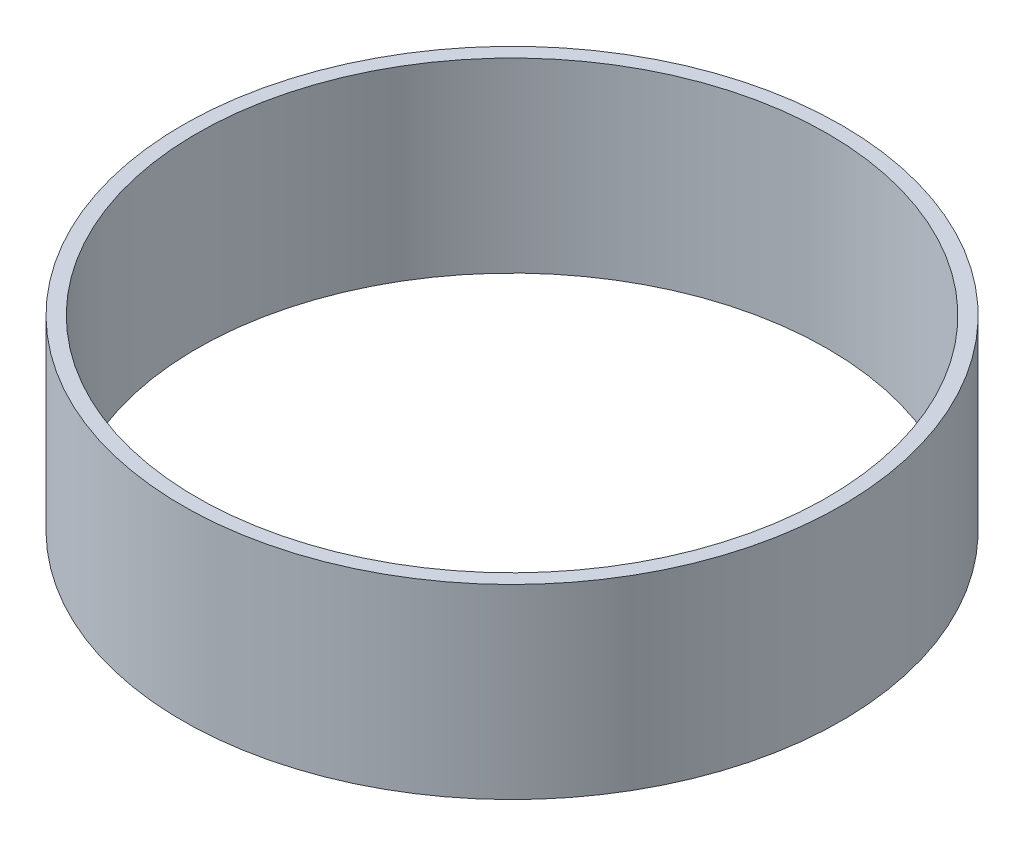
ISO-10303-21;
HEADER;
FILE_DESCRIPTION(('STEP AP214'),'2;1');
FILE_NAME('part.step','',(''),(''),'','','');
FILE_SCHEMA(('AUTOMOTIVE_DESIGN { 1 0 10303 214 1 1 1 1 }'));
ENDSEC;
DATA;
#1=APPLICATION_CONTEXT('core data for automotive mechanical design processes');
#2=APPLICATION_PROTOCOL_DEFINITION('international standard','automotive_design',2000,#1);
#3=PRODUCT_CONTEXT('',#1,'mechanical');
#4=PRODUCT('Part','Part','',(#3));
#5=PRODUCT_RELATED_PRODUCT_CATEGORY('part','',(#4));
#6=PRODUCT_DEFINITION_FORMATION('','',#4);
#7=PRODUCT_DEFINITION_CONTEXT('part definition',#1,'design');
#8=PRODUCT_DEFINITION('design','',#6,#7);
#9=PRODUCT_DEFINITION_SHAPE('','',#8);
#10=(LENGTH_UNIT() NAMED_UNIT(*) SI_UNIT(.MILLI.,.METRE.));
#11=(NAMED_UNIT(*) PLANE_ANGLE_UNIT() SI_UNIT($,.RADIAN.));
#12=(NAMED_UNIT(*) SI_UNIT($,.STERADIAN.) SOLID_ANGLE_UNIT());
#13=UNCERTAINTY_MEASURE_WITH_UNIT(LENGTH_MEASURE(1.E-05),#10,'distance_accuracy_value','');
#14=(GEOMETRIC_REPRESENTATION_CONTEXT(3) GLOBAL_UNCERTAINTY_ASSIGNED_CONTEXT((#13)) GLOBAL_UNIT_ASSIGNED_CONTEXT((#10,
#11,#12)) REPRESENTATION_CONTEXT('',''));
#15=CARTESIAN_POINT('',(0.,0.,0.));
#16=DIRECTION('',(0.,0.,1.));
#17=DIRECTION('',(1.,0.,0.));
#18=AXIS2_PLACEMENT_3D('',#15,#16,#17);
#19=CARTESIAN_POINT('',(0.,26.,0.));
#20=DIRECTION('',(0.,1.,0.));
#21=DIRECTION('',(0.,0.,1.));
#22=AXIS2_PLACEMENT_3D('',#19,#20,#21);
#23=PLANE('',#22);
#24=CARTESIAN_POINT('',(0.,26.,0.));
#25=DIRECTION('',(0.,1.,0.));
#26=DIRECTION('',(0.,0.,1.));
#27=AXIS2_PLACEMENT_3D('',#24,#25,#26);
#28=CIRCLE('',#27,46.);
#29=CARTESIAN_POINT('',(0.,26.,-46.));
#30=VERTEX_POINT('',#29);
#31=EDGE_CURVE('E10',#30,#30,#28,.T.);
#32=ORIENTED_EDGE('',*,*,#31,.T.);
#33=EDGE_LOOP('',(#32));
#34=FACE_BOUND('',#33,.T.);
#35=CARTESIAN_POINT('',(0.,26.,0.));
#36=DIRECTION('',(0.,1.,0.));
#37=DIRECTION('',(0.,0.,1.));
#38=AXIS2_PLACEMENT_3D('',#35,#36,#37);
#39=CIRCLE('',#38,44.);
#40=CARTESIAN_POINT('',(0.,26.,-44.));
#41=VERTEX_POINT('',#40);
#42=EDGE_CURVE('E43',#41,#41,#39,.T.);
#43=ORIENTED_EDGE('',*,*,#42,.F.);
#44=EDGE_LOOP('',(#43));
#45=FACE_BOUND('',#44,.T.);
#46=ADVANCED_FACE('F32',(#34,#45),#23,.T.);
#47=CARTESIAN_POINT('',(0.,0.,0.));
#48=DIRECTION('',(0.,1.,0.));
#49=DIRECTION('',(0.,0.,1.));
#50=AXIS2_PLACEMENT_3D('',#47,#48,#49);
#51=PLANE('',#50);
#52=CARTESIAN_POINT('',(0.,0.,0.));
#53=DIRECTION('',(0.,1.,0.));
#54=DIRECTION('',(0.,0.,1.));
#55=AXIS2_PLACEMENT_3D('',#52,#53,#54);
#56=CIRCLE('',#55,46.);
#57=CARTESIAN_POINT('',(0.,0.,-46.));
#58=VERTEX_POINT('',#57);
#59=EDGE_CURVE('E36',#58,#58,#56,.T.);
#60=ORIENTED_EDGE('',*,*,#59,.F.);
#61=EDGE_LOOP('',(#60));
#62=FACE_BOUND('',#61,.T.);
#63=CARTESIAN_POINT('',(0.,0.,0.));
#64=DIRECTION('',(0.,1.,0.));
#65=DIRECTION('',(0.,0.,1.));
#66=AXIS2_PLACEMENT_3D('',#63,#64,#65);
#67=CIRCLE('',#66,44.);
#68=CARTESIAN_POINT('',(0.,0.,-44.));
#69=VERTEX_POINT('',#68);
#70=EDGE_CURVE('E45',#69,#69,#67,.T.);
#71=ORIENTED_EDGE('',*,*,#70,.T.);
#72=EDGE_LOOP('',(#71));
#73=FACE_BOUND('',#72,.T.);
#74=ADVANCED_FACE('F55',(#62,#73),#51,.F.);
#75=CARTESIAN_POINT('',(0.,26.,0.));
#76=DIRECTION('',(0.,-1.,0.));
#77=DIRECTION('',(0.,0.,-1.));
#78=AXIS2_PLACEMENT_3D('',#75,#76,#77);
#79=CYLINDRICAL_SURFACE('',#78,46.);
#80=CARTESIAN_POINT('',(0.,26.,-46.));
#81=CARTESIAN_POINT('',(0.,25.7291666666667,-46.));
#82=CARTESIAN_POINT('',(0.,25.4583333333333,-46.));
#83=CARTESIAN_POINT('',(0.,24.9166666666667,-46.));
#84=CARTESIAN_POINT('',(0.,24.6458333333333,-46.));
#85=CARTESIAN_POINT('',(0.,24.1041666666667,-46.));
#86=CARTESIAN_POINT('',(0.,23.8333333333333,-46.));
#87=CARTESIAN_POINT('',(0.,23.2916666666667,-46.));
#88=CARTESIAN_POINT('',(0.,23.0208333333333,-46.));
#89=CARTESIAN_POINT('',(0.,22.4791666666667,-46.));
#90=CARTESIAN_POINT('',(0.,22.2083333333333,-46.));
#91=CARTESIAN_POINT('',(0.,21.6666666666667,-46.));
#92=CARTESIAN_POINT('',(0.,21.3958333333333,-46.));
#93=CARTESIAN_POINT('',(0.,20.8541666666667,-46.));
#94=CARTESIAN_POINT('',(0.,20.5833333333333,-46.));
#95=CARTESIAN_POINT('',(0.,20.0416666666667,-46.));
#96=CARTESIAN_POINT('',(0.,19.7708333333333,-46.));
#97=CARTESIAN_POINT('',(0.,19.2291666666667,-46.));
#98=CARTESIAN_POINT('',(0.,18.9583333333333,-46.));
#99=CARTESIAN_POINT('',(0.,18.4166666666667,-46.));
#100=CARTESIAN_POINT('',(0.,18.1458333333333,-46.));
#101=CARTESIAN_POINT('',(0.,17.6041666666667,-46.));
#102=CARTESIAN_POINT('',(0.,17.3333333333333,-46.));
#103=CARTESIAN_POINT('',(0.,16.7916666666667,-46.));
#104=CARTESIAN_POINT('',(0.,16.5208333333333,-46.));
#105=CARTESIAN_POINT('',(0.,15.9791666666667,-46.));
#106=CARTESIAN_POINT('',(0.,15.7083333333333,-46.));
#107=CARTESIAN_POINT('',(0.,15.1666666666667,-46.));
#108=CARTESIAN_POINT('',(0.,14.8958333333333,-46.));
#109=CARTESIAN_POINT('',(0.,14.3541666666667,-46.));
#110=CARTESIAN_POINT('',(0.,14.0833333333333,-46.));
#111=CARTESIAN_POINT('',(0.,13.5416666666667,-46.));
#112=CARTESIAN_POINT('',(0.,13.2708333333333,-46.));
#113=CARTESIAN_POINT('',(0.,12.7291666666667,-46.));
#114=CARTESIAN_POINT('',(0.,12.4583333333333,-46.));
#115=CARTESIAN_POINT('',(0.,11.9166666666667,-46.));
#116=CARTESIAN_POINT('',(0.,11.6458333333333,-46.));
#117=CARTESIAN_POINT('',(0.,11.1041666666667,-46.));
#118=CARTESIAN_POINT('',(0.,10.8333333333333,-46.));
#119=CARTESIAN_POINT('',(0.,10.2916666666667,-46.));
#120=CARTESIAN_POINT('',(0.,10.0208333333333,-46.));
#121=CARTESIAN_POINT('',(0.,9.47916666666667,-46.));
#122=CARTESIAN_POINT('',(0.,9.20833333333333,-46.));
#123=CARTESIAN_POINT('',(0.,8.66666666666667,-46.));
#124=CARTESIAN_POINT('',(0.,8.39583333333333,-46.));
#125=CARTESIAN_POINT('',(0.,7.85416666666667,-46.));
#126=CARTESIAN_POINT('',(0.,7.58333333333333,-46.));
#127=CARTESIAN_POINT('',(0.,7.04166666666667,-46.));
#128=CARTESIAN_POINT('',(0.,6.77083333333333,-46.));
#129=CARTESIAN_POINT('',(0.,6.22916666666667,-46.));
#130=CARTESIAN_POINT('',(0.,5.95833333333333,-46.));
#131=CARTESIAN_POINT('',(0.,5.41666666666667,-46.));
#132=CARTESIAN_POINT('',(0.,5.14583333333333,-46.));
#133=CARTESIAN_POINT('',(0.,4.60416666666667,-46.));
#134=CARTESIAN_POINT('',(0.,4.33333333333333,-46.));
#135=CARTESIAN_POINT('',(0.,3.79166666666667,-46.));
#136=CARTESIAN_POINT('',(0.,3.52083333333333,-46.));
#137=CARTESIAN_POINT('',(0.,2.97916666666667,-46.));
#138=CARTESIAN_POINT('',(0.,2.70833333333333,-46.));
#139=CARTESIAN_POINT('',(0.,2.16666666666667,-46.));
#140=CARTESIAN_POINT('',(0.,1.89583333333333,-46.));
#141=CARTESIAN_POINT('',(0.,1.35416666666667,-46.));
#142=CARTESIAN_POINT('',(0.,1.08333333333333,-46.));
#143=CARTESIAN_POINT('',(0.,0.541666666666667,-46.));
#144=CARTESIAN_POINT('',(0.,0.270833333333334,-46.));
#145=CARTESIAN_POINT('',(0.,0.,-46.));
#146=B_SPLINE_CURVE_WITH_KNOTS('',3,(#80,#81,#82,#83,#84,#85,#86,#87,#88,#89,#90,#91,#92,#93,
#94,#95,#96,#97,#98,#99,#100,#101,#102,#103,#104,#105,#106,#107,#108,#109,#110,#111,#112,#113,
#114,#115,#116,#117,#118,#119,#120,#121,#122,#123,#124,#125,#126,#127,#128,#129,#130,#131,#132,
#133,#134,#135,#136,#137,#138,#139,#140,#141,#142,#143,#144,#145),.UNSPECIFIED.,.F.,.F.,(4,2,2,
2,2,2,2,2,2,2,2,2,2,2,2,2,2,2,2,2,2,2,2,2,2,2,2,2,2,2,2,2,4),(0.,0.812499999999997,1.625,2.4375,
3.25,4.0625,4.875,5.6875,6.5,7.3125,8.125,8.93749999999999,9.74999999999999,10.5625,11.375,
12.1875,13.,13.8125,14.625,15.4375,16.25,17.0625,17.875,18.6875,19.5,20.3125,21.125,21.9375,
22.75,23.5625,24.375,25.1875,26.),.UNSPECIFIED.);
#147=EDGE_CURVE('BSEAM34',#30,#58,#146,.T.);
#148=ORIENTED_EDGE('',*,*,#31,.F.);
#149=ORIENTED_EDGE('',*,*,#59,.T.);
#150=ORIENTED_EDGE('',*,*,#147,.T.);
#151=ORIENTED_EDGE('',*,*,#147,.F.);
#152=EDGE_LOOP('',(#148,#150,#149,#151));
#153=FACE_BOUND('',#152,.T.);
#154=ADVANCED_FACE('F34',(#153),#79,.T.);
#155=CARTESIAN_POINT('',(0.,26.,0.));
#156=DIRECTION('',(0.,-1.,0.));
#157=DIRECTION('',(0.,0.,-1.));
#158=AXIS2_PLACEMENT_3D('',#155,#156,#157);
#159=CYLINDRICAL_SURFACE('',#158,44.);
#160=CARTESIAN_POINT('',(0.,26.,-44.));
#161=CARTESIAN_POINT('',(0.,25.7291666666667,-44.));
#162=CARTESIAN_POINT('',(0.,25.4583333333333,-44.));
#163=CARTESIAN_POINT('',(0.,24.9166666666667,-44.));
#164=CARTESIAN_POINT('',(0.,24.6458333333333,-44.));
#165=CARTESIAN_POINT('',(0.,24.1041666666667,-44.));
#166=CARTESIAN_POINT('',(0.,23.8333333333333,-44.));
#167=CARTESIAN_POINT('',(0.,23.2916666666667,-44.));
#168=CARTESIAN_POINT('',(0.,23.0208333333333,-44.));
#169=CARTESIAN_POINT('',(0.,22.4791666666667,-44.));
#170=CARTESIAN_POINT('',(0.,22.2083333333333,-44.));
#171=CARTESIAN_POINT('',(0.,21.6666666666667,-44.));
#172=CARTESIAN_POINT('',(0.,21.3958333333333,-44.));
#173=CARTESIAN_POINT('',(0.,20.8541666666667,-44.));
#174=CARTESIAN_POINT('',(0.,20.5833333333333,-44.));
#175=CARTESIAN_POINT('',(0.,20.0416666666667,-44.));
#176=CARTESIAN_POINT('',(0.,19.7708333333333,-44.));
#177=CARTESIAN_POINT('',(0.,19.2291666666667,-44.));
#178=CARTESIAN_POINT('',(0.,18.9583333333333,-44.));
#179=CARTESIAN_POINT('',(0.,18.4166666666667,-44.));
#180=CARTESIAN_POINT('',(0.,18.1458333333333,-44.));
#181=CARTESIAN_POINT('',(0.,17.6041666666667,-44.));
#182=CARTESIAN_POINT('',(0.,17.3333333333333,-44.));
#183=CARTESIAN_POINT('',(0.,16.7916666666667,-44.));
#184=CARTESIAN_POINT('',(0.,16.5208333333333,-44.));
#185=CARTESIAN_POINT('',(0.,15.9791666666667,-44.));
#186=CARTESIAN_POINT('',(0.,15.7083333333333,-44.));
#187=CARTESIAN_POINT('',(0.,15.1666666666667,-44.));
#188=CARTESIAN_POINT('',(0.,14.8958333333333,-44.));
#189=CARTESIAN_POINT('',(0.,14.3541666666667,-44.));
#190=CARTESIAN_POINT('',(0.,14.0833333333333,-44.));
#191=CARTESIAN_POINT('',(0.,13.5416666666667,-44.));
#192=CARTESIAN_POINT('',(0.,13.2708333333333,-44.));
#193=CARTESIAN_POINT('',(0.,12.7291666666667,-44.));
#194=CARTESIAN_POINT('',(0.,12.4583333333333,-44.));
#195=CARTESIAN_POINT('',(0.,11.9166666666667,-44.));
#196=CARTESIAN_POINT('',(0.,11.6458333333333,-44.));
#197=CARTESIAN_POINT('',(0.,11.1041666666667,-44.));
#198=CARTESIAN_POINT('',(0.,10.8333333333333,-44.));
#199=CARTESIAN_POINT('',(0.,10.2916666666667,-44.));
#200=CARTESIAN_POINT('',(0.,10.0208333333333,-44.));
#201=CARTESIAN_POINT('',(0.,9.47916666666667,-44.));
#202=CARTESIAN_POINT('',(0.,9.20833333333333,-44.));
#203=CARTESIAN_POINT('',(0.,8.66666666666667,-44.));
#204=CARTESIAN_POINT('',(0.,8.39583333333333,-44.));
#205=CARTESIAN_POINT('',(0.,7.85416666666667,-44.));
#206=CARTESIAN_POINT('',(0.,7.58333333333333,-44.));
#207=CARTESIAN_POINT('',(0.,7.04166666666667,-44.));
#208=CARTESIAN_POINT('',(0.,6.77083333333333,-44.));
#209=CARTESIAN_POINT('',(0.,6.22916666666667,-44.));
#210=CARTESIAN_POINT('',(0.,5.95833333333333,-44.));
#211=CARTESIAN_POINT('',(0.,5.41666666666667,-44.));
#212=CARTESIAN_POINT('',(0.,5.14583333333333,-44.));
#213=CARTESIAN_POINT('',(0.,4.60416666666667,-44.));
#214=CARTESIAN_POINT('',(0.,4.33333333333333,-44.));
#215=CARTESIAN_POINT('',(0.,3.79166666666667,-44.));
#216=CARTESIAN_POINT('',(0.,3.52083333333333,-44.));
#217=CARTESIAN_POINT('',(0.,2.97916666666667,-44.));
#218=CARTESIAN_POINT('',(0.,2.70833333333333,-44.));
#219=CARTESIAN_POINT('',(0.,2.16666666666667,-44.));
#220=CARTESIAN_POINT('',(0.,1.89583333333333,-44.));
#221=CARTESIAN_POINT('',(0.,1.35416666666667,-44.));
#222=CARTESIAN_POINT('',(0.,1.08333333333333,-44.));
#223=CARTESIAN_POINT('',(0.,0.541666666666667,-44.));
#224=CARTESIAN_POINT('',(0.,0.270833333333334,-44.));
#225=CARTESIAN_POINT('',(0.,0.,-44.));
#226=B_SPLINE_CURVE_WITH_KNOTS('',3,(#160,#161,#162,#163,#164,#165,#166,#167,#168,#169,#170,
#171,#172,#173,#174,#175,#176,#177,#178,#179,#180,#181,#182,#183,#184,#185,#186,#187,#188,#189,
#190,#191,#192,#193,#194,#195,#196,#197,#198,#199,#200,#201,#202,#203,#204,#205,#206,#207,#208,
#209,#210,#211,#212,#213,#214,#215,#216,#217,#218,#219,#220,#221,#222,#223,#224,#225),
.UNSPECIFIED.,.F.,.F.,(4,2,2,2,2,2,2,2,2,2,2,2,2,2,2,2,2,2,2,2,2,2,2,2,2,2,2,2,2,2,2,2,4),(0.,
0.812500000000001,1.625,2.4375,3.25,4.0625,4.875,5.6875,6.5,7.3125,8.125,8.9375,9.75,10.5625,
11.375,12.1875,13.,13.8125,14.625,15.4375,16.25,17.0625,17.875,18.6875,19.5,20.3125,21.125,
21.9375,22.75,23.5625,24.375,25.1875,26.),.UNSPECIFIED.);
#227=EDGE_CURVE('BSEAM51',#41,#69,#226,.T.);
#228=ORIENTED_EDGE('',*,*,#42,.T.);
#229=ORIENTED_EDGE('',*,*,#70,.F.);
#230=ORIENTED_EDGE('',*,*,#227,.T.);
#231=ORIENTED_EDGE('',*,*,#227,.F.);
#232=EDGE_LOOP('',(#228,#230,#229,#231));
#233=FACE_BOUND('',#232,.T.);
#234=ADVANCED_FACE('F51',(#233),#159,.F.);
#235=CLOSED_SHELL('',(#46,#74,#154,#234));
#236=MANIFOLD_SOLID_BREP('B2',#235);
#237=ADVANCED_BREP_SHAPE_REPRESENTATION('',(#18,#236),#14);
#238=SHAPE_DEFINITION_REPRESENTATION(#9,#237);
ENDSEC;
END-ISO-10303-21;
